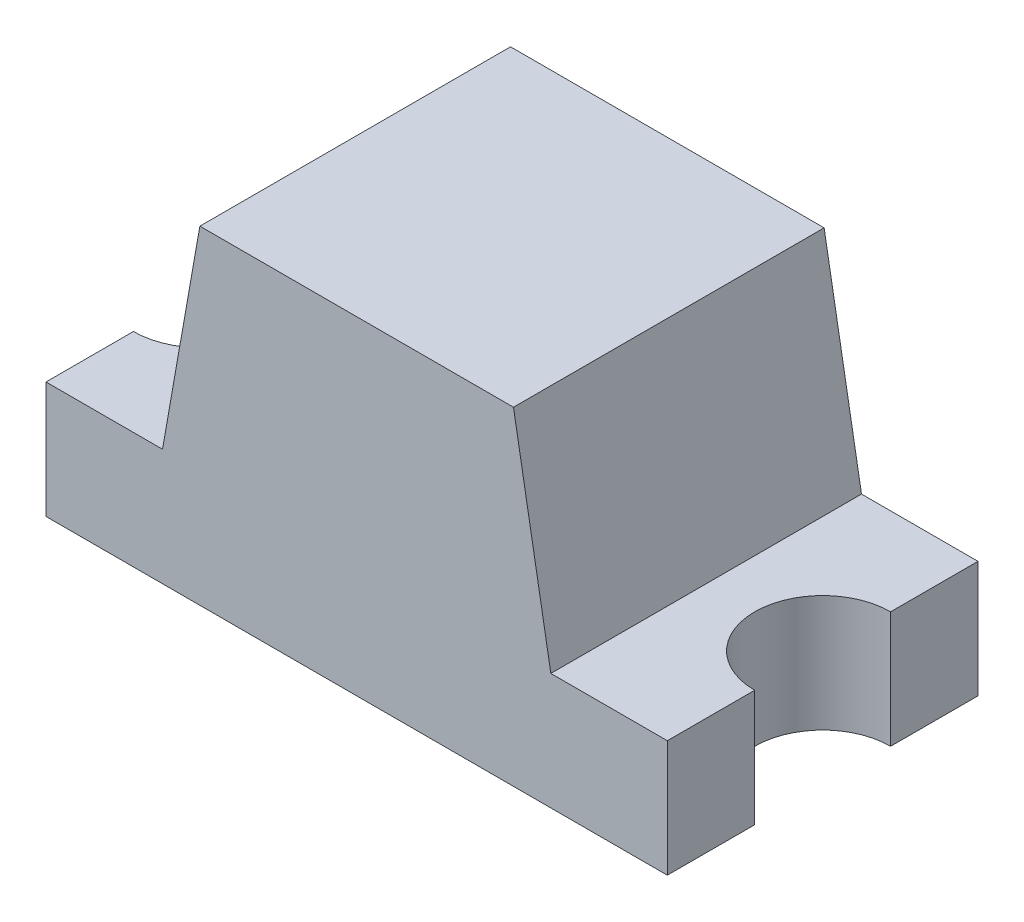
ISO-10303-21;
HEADER;
FILE_DESCRIPTION(('STEP AP214'),'2;1');
FILE_NAME('part.step','',(''),(''),'','','');
FILE_SCHEMA(('AUTOMOTIVE_DESIGN { 1 0 10303 214 1 1 1 1 }'));
ENDSEC;
DATA;
#1=APPLICATION_CONTEXT('core data for automotive mechanical design processes');
#2=APPLICATION_PROTOCOL_DEFINITION('international standard','automotive_design',2000,#1);
#3=PRODUCT_CONTEXT('',#1,'mechanical');
#4=PRODUCT('Part','Part','',(#3));
#5=PRODUCT_RELATED_PRODUCT_CATEGORY('part','',(#4));
#6=PRODUCT_DEFINITION_FORMATION('','',#4);
#7=PRODUCT_DEFINITION_CONTEXT('part definition',#1,'design');
#8=PRODUCT_DEFINITION('design','',#6,#7);
#9=PRODUCT_DEFINITION_SHAPE('','',#8);
#10=(LENGTH_UNIT() NAMED_UNIT(*) SI_UNIT(.MILLI.,.METRE.));
#11=(NAMED_UNIT(*) PLANE_ANGLE_UNIT() SI_UNIT($,.RADIAN.));
#12=(NAMED_UNIT(*) SI_UNIT($,.STERADIAN.) SOLID_ANGLE_UNIT());
#13=UNCERTAINTY_MEASURE_WITH_UNIT(LENGTH_MEASURE(1.E-05),#10,'distance_accuracy_value','');
#14=(GEOMETRIC_REPRESENTATION_CONTEXT(3) GLOBAL_UNCERTAINTY_ASSIGNED_CONTEXT((#13)) GLOBAL_UNIT_ASSIGNED_CONTEXT((#10,
#11,#12)) REPRESENTATION_CONTEXT('',''));
#15=CARTESIAN_POINT('',(0.,0.,0.));
#16=DIRECTION('',(0.,0.,1.));
#17=DIRECTION('',(1.,0.,0.));
#18=AXIS2_PLACEMENT_3D('',#15,#16,#17);
#19=CARTESIAN_POINT('',(0.40379548164148,0.845602935931751,0.4));
#20=DIRECTION('',(0.984807753012208,0.17364817766693,0.));
#21=DIRECTION('',(-0.17364817766693,0.984807753012208,0.));
#22=AXIS2_PLACEMENT_3D('',#19,#20,#21);
#23=PLANE('',#22);
#24=DIRECTION('',(0.173648177666931,-0.984807753012208,0.));
#25=VECTOR('',#24,1.);
#26=CARTESIAN_POINT('',(0.40379548164148,0.845602935931751,-0.4));
#27=LINE('',#26,#25);
#28=CARTESIAN_POINT('',(0.40379548164148,0.845602935931751,-0.4));
#29=VERTEX_POINT('',#28);
#30=CARTESIAN_POINT('',(0.5,0.3,-0.4));
#31=VERTEX_POINT('',#30);
#32=EDGE_CURVE('E145',#29,#31,#27,.T.);
#33=ORIENTED_EDGE('',*,*,#32,.F.);
#34=DIRECTION('',(0.,0.,1.));
#35=VECTOR('',#34,1.);
#36=CARTESIAN_POINT('',(0.40379548164148,0.845602935931751,0.4));
#37=LINE('',#36,#35);
#38=CARTESIAN_POINT('',(0.40379548164148,0.845602935931751,0.4));
#39=VERTEX_POINT('',#38);
#40=EDGE_CURVE('E130',#39,#29,#37,.F.);
#41=ORIENTED_EDGE('',*,*,#40,.F.);
#42=DIRECTION('',(-0.173648177666931,0.984807753012208,0.));
#43=VECTOR('',#42,1.);
#44=CARTESIAN_POINT('',(0.5,0.3,0.4));
#45=LINE('',#44,#43);
#46=CARTESIAN_POINT('',(0.5,0.3,0.4));
#47=VERTEX_POINT('',#46);
#48=EDGE_CURVE('E179',#47,#39,#45,.T.);
#49=ORIENTED_EDGE('',*,*,#48,.F.);
#50=DIRECTION('',(0.,0.,1.));
#51=VECTOR('',#50,1.);
#52=CARTESIAN_POINT('',(0.5,0.3,0.));
#53=LINE('',#52,#51);
#54=EDGE_CURVE('E152',#31,#47,#53,.T.);
#55=ORIENTED_EDGE('',*,*,#54,.F.);
#56=EDGE_LOOP('',(#33,#41,#49,#55));
#57=FACE_BOUND('',#56,.T.);
#58=ADVANCED_FACE('F20',(#57),#23,.T.);
#59=CARTESIAN_POINT('',(-0.403795481641481,0.845602935931751,0.4));
#60=DIRECTION('',(0.,1.,0.));
#61=DIRECTION('',(0.,0.,1.));
#62=AXIS2_PLACEMENT_3D('',#59,#60,#61);
#63=PLANE('',#62);
#64=DIRECTION('',(-1.,0.,0.));
#65=VECTOR('',#64,1.);
#66=CARTESIAN_POINT('',(0.8,0.845602935931751,-0.4));
#67=LINE('',#66,#65);
#68=CARTESIAN_POINT('',(-0.403795481641481,0.845602935931751,-0.4));
#69=VERTEX_POINT('',#68);
#70=EDGE_CURVE('E134',#69,#29,#67,.F.);
#71=ORIENTED_EDGE('',*,*,#70,.F.);
#72=DIRECTION('',(0.,0.,1.));
#73=VECTOR('',#72,1.);
#74=CARTESIAN_POINT('',(-0.403795481641481,0.845602935931751,0.4));
#75=LINE('',#74,#73);
#76=CARTESIAN_POINT('',(-0.403795481641481,0.845602935931751,0.4));
#77=VERTEX_POINT('',#76);
#78=EDGE_CURVE('E140',#77,#69,#75,.F.);
#79=ORIENTED_EDGE('',*,*,#78,.F.);
#80=DIRECTION('',(1.,0.,0.));
#81=VECTOR('',#80,1.);
#82=CARTESIAN_POINT('',(-0.800000000000001,0.845602935931751,0.4));
#83=LINE('',#82,#81);
#84=EDGE_CURVE('E135',#39,#77,#83,.F.);
#85=ORIENTED_EDGE('',*,*,#84,.F.);
#86=ORIENTED_EDGE('',*,*,#40,.T.);
#87=EDGE_LOOP('',(#71,#79,#85,#86));
#88=FACE_BOUND('',#87,.T.);
#89=ADVANCED_FACE('F132',(#88),#63,.T.);
#90=CARTESIAN_POINT('',(-0.5,0.3,0.4));
#91=DIRECTION('',(-0.984807753012208,0.17364817766693,0.));
#92=DIRECTION('',(-0.17364817766693,-0.984807753012208,0.));
#93=AXIS2_PLACEMENT_3D('',#90,#91,#92);
#94=PLANE('',#93);
#95=DIRECTION('',(0.173648177666929,0.984807753012208,0.));
#96=VECTOR('',#95,1.);
#97=CARTESIAN_POINT('',(-0.5,0.3,-0.4));
#98=LINE('',#97,#96);
#99=CARTESIAN_POINT('',(-0.5,0.3,-0.4));
#100=VERTEX_POINT('',#99);
#101=EDGE_CURVE('E149',#100,#69,#98,.T.);
#102=ORIENTED_EDGE('',*,*,#101,.F.);
#103=DIRECTION('',(0.,0.,1.));
#104=VECTOR('',#103,1.);
#105=CARTESIAN_POINT('',(-0.5,0.3,0.));
#106=LINE('',#105,#104);
#107=CARTESIAN_POINT('',(-0.5,0.3,0.4));
#108=VERTEX_POINT('',#107);
#109=EDGE_CURVE('E184',#108,#100,#106,.F.);
#110=ORIENTED_EDGE('',*,*,#109,.F.);
#111=DIRECTION('',(-0.173648177666929,-0.984807753012208,0.));
#112=VECTOR('',#111,1.);
#113=CARTESIAN_POINT('',(-0.403795481641481,0.845602935931751,0.4));
#114=LINE('',#113,#112);
#115=EDGE_CURVE('E239',#77,#108,#114,.T.);
#116=ORIENTED_EDGE('',*,*,#115,.F.);
#117=ORIENTED_EDGE('',*,*,#78,.T.);
#118=EDGE_LOOP('',(#102,#110,#116,#117));
#119=FACE_BOUND('',#118,.T.);
#120=ADVANCED_FACE('F393',(#119),#94,.T.);
#121=CARTESIAN_POINT('',(0.,0.3,0.));
#122=DIRECTION('',(0.,1.,0.));
#123=DIRECTION('',(0.,0.,1.));
#124=AXIS2_PLACEMENT_3D('',#121,#122,#123);
#125=PLANE('',#124);
#126=CARTESIAN_POINT('',(-0.8,0.3,0.));
#127=DIRECTION('',(0.,1.,0.));
#128=DIRECTION('',(0.,0.,1.));
#129=AXIS2_PLACEMENT_3D('',#126,#127,#128);
#130=CIRCLE('',#129,0.175);
#131=CARTESIAN_POINT('',(-0.8,0.3,-0.175));
#132=VERTEX_POINT('',#131);
#133=CARTESIAN_POINT('',(-0.800000000000001,0.3,0.175));
#134=VERTEX_POINT('',#133);
#135=EDGE_CURVE('E24',#132,#134,#130,.F.);
#136=ORIENTED_EDGE('',*,*,#135,.T.);
#137=DIRECTION('',(0.,0.,1.));
#138=VECTOR('',#137,1.);
#139=CARTESIAN_POINT('',(-0.800000000000001,0.3,0.175));
#140=LINE('',#139,#138);
#141=CARTESIAN_POINT('',(-0.800000000000001,0.3,0.4));
#142=VERTEX_POINT('',#141);
#143=EDGE_CURVE('E230',#142,#134,#140,.F.);
#144=ORIENTED_EDGE('',*,*,#143,.F.);
#145=DIRECTION('',(1.,0.,0.));
#146=VECTOR('',#145,1.);
#147=CARTESIAN_POINT('',(-0.800000000000001,0.3,0.4));
#148=LINE('',#147,#146);
#149=EDGE_CURVE('E235',#108,#142,#148,.F.);
#150=ORIENTED_EDGE('',*,*,#149,.F.);
#151=ORIENTED_EDGE('',*,*,#109,.T.);
#152=DIRECTION('',(-1.,0.,0.));
#153=VECTOR('',#152,1.);
#154=CARTESIAN_POINT('',(0.8,0.3,-0.4));
#155=LINE('',#154,#153);
#156=CARTESIAN_POINT('',(-0.8,0.3,-0.4));
#157=VERTEX_POINT('',#156);
#158=EDGE_CURVE('E193',#157,#100,#155,.F.);
#159=ORIENTED_EDGE('',*,*,#158,.F.);
#160=DIRECTION('',(0.,0.,1.));
#161=VECTOR('',#160,1.);
#162=CARTESIAN_POINT('',(-0.8,0.3,-0.4));
#163=LINE('',#162,#161);
#164=EDGE_CURVE('E81',#132,#157,#163,.F.);
#165=ORIENTED_EDGE('',*,*,#164,.F.);
#166=EDGE_LOOP('',(#136,#144,#150,#151,#159,#165));
#167=FACE_BOUND('',#166,.T.);
#168=ADVANCED_FACE('F350',(#167),#125,.T.);
#169=CARTESIAN_POINT('',(0.,0.3,0.));
#170=DIRECTION('',(0.,1.,0.));
#171=DIRECTION('',(0.,0.,1.));
#172=AXIS2_PLACEMENT_3D('',#169,#170,#171);
#173=PLANE('',#172);
#174=DIRECTION('',(0.,0.,-1.));
#175=VECTOR('',#174,1.);
#176=CARTESIAN_POINT('',(0.8,0.3,-0.175));
#177=LINE('',#176,#175);
#178=CARTESIAN_POINT('',(0.8,0.3,-0.4));
#179=VERTEX_POINT('',#178);
#180=CARTESIAN_POINT('',(0.8,0.3,-0.175));
#181=VERTEX_POINT('',#180);
#182=EDGE_CURVE('E183',#179,#181,#177,.F.);
#183=ORIENTED_EDGE('',*,*,#182,.F.);
#184=DIRECTION('',(-1.,0.,0.));
#185=VECTOR('',#184,1.);
#186=CARTESIAN_POINT('',(0.8,0.3,-0.4));
#187=LINE('',#186,#185);
#188=EDGE_CURVE('E155',#31,#179,#187,.F.);
#189=ORIENTED_EDGE('',*,*,#188,.F.);
#190=ORIENTED_EDGE('',*,*,#54,.T.);
#191=DIRECTION('',(1.,0.,0.));
#192=VECTOR('',#191,1.);
#193=CARTESIAN_POINT('',(-0.800000000000001,0.3,0.4));
#194=LINE('',#193,#192);
#195=CARTESIAN_POINT('',(0.8,0.3,0.4));
#196=VERTEX_POINT('',#195);
#197=EDGE_CURVE('E223',#196,#47,#194,.F.);
#198=ORIENTED_EDGE('',*,*,#197,.F.);
#199=DIRECTION('',(0.,0.,-1.));
#200=VECTOR('',#199,1.);
#201=CARTESIAN_POINT('',(0.8,0.3,0.4));
#202=LINE('',#201,#200);
#203=CARTESIAN_POINT('',(0.8,0.3,0.175));
#204=VERTEX_POINT('',#203);
#205=EDGE_CURVE('E216',#204,#196,#202,.F.);
#206=ORIENTED_EDGE('',*,*,#205,.F.);
#207=CARTESIAN_POINT('',(0.8,0.3,0.));
#208=DIRECTION('',(0.,1.,0.));
#209=DIRECTION('',(0.,0.,1.));
#210=AXIS2_PLACEMENT_3D('',#207,#208,#209);
#211=CIRCLE('',#210,0.175);
#212=EDGE_CURVE('E261',#204,#181,#211,.F.);
#213=ORIENTED_EDGE('',*,*,#212,.T.);
#214=EDGE_LOOP('',(#183,#189,#190,#198,#206,#213));
#215=FACE_BOUND('',#214,.T.);
#216=ADVANCED_FACE('F358',(#215),#173,.T.);
#217=CARTESIAN_POINT('',(0.8,0.,-0.175));
#218=DIRECTION('',(1.,0.,0.));
#219=DIRECTION('',(0.,0.,-1.));
#220=AXIS2_PLACEMENT_3D('',#217,#218,#219);
#221=PLANE('',#220);
#222=ORIENTED_EDGE('',*,*,#182,.T.);
#223=DIRECTION('',(0.,1.,0.));
#224=VECTOR('',#223,1.);
#225=CARTESIAN_POINT('',(0.8,0.,-0.175));
#226=LINE('',#225,#224);
#227=CARTESIAN_POINT('',(0.8,0.,-0.175));
#228=VERTEX_POINT('',#227);
#229=EDGE_CURVE('E264',#181,#228,#226,.F.);
#230=ORIENTED_EDGE('',*,*,#229,.T.);
#231=DIRECTION('',(0.,0.,1.));
#232=VECTOR('',#231,1.);
#233=CARTESIAN_POINT('',(0.8,0.,0.));
#234=LINE('',#233,#232);
#235=CARTESIAN_POINT('',(0.8,0.,-0.4));
#236=VERTEX_POINT('',#235);
#237=EDGE_CURVE('E267',#228,#236,#234,.F.);
#238=ORIENTED_EDGE('',*,*,#237,.T.);
#239=DIRECTION('',(0.,1.,0.));
#240=VECTOR('',#239,1.);
#241=CARTESIAN_POINT('',(0.8,0.,-0.4));
#242=LINE('',#241,#240);
#243=EDGE_CURVE('E159',#179,#236,#242,.F.);
#244=ORIENTED_EDGE('',*,*,#243,.F.);
#245=EDGE_LOOP('',(#222,#230,#238,#244));
#246=FACE_BOUND('',#245,.T.);
#247=ADVANCED_FACE('F416',(#246),#221,.T.);
#248=CARTESIAN_POINT('',(0.8,0.,-0.4));
#249=DIRECTION('',(0.,0.,-1.));
#250=DIRECTION('',(-1.,0.,0.));
#251=AXIS2_PLACEMENT_3D('',#248,#249,#250);
#252=PLANE('',#251);
#253=ORIENTED_EDGE('',*,*,#188,.T.);
#254=ORIENTED_EDGE('',*,*,#243,.T.);
#255=DIRECTION('',(1.,0.,0.));
#256=VECTOR('',#255,1.);
#257=CARTESIAN_POINT('',(0.,0.,-0.4));
#258=LINE('',#257,#256);
#259=CARTESIAN_POINT('',(-0.8,0.,-0.4));
#260=VERTEX_POINT('',#259);
#261=EDGE_CURVE('E289',#236,#260,#258,.F.);
#262=ORIENTED_EDGE('',*,*,#261,.T.);
#263=DIRECTION('',(0.,1.,0.));
#264=VECTOR('',#263,1.);
#265=CARTESIAN_POINT('',(-0.8,0.,-0.4));
#266=LINE('',#265,#264);
#267=EDGE_CURVE('E190',#157,#260,#266,.F.);
#268=ORIENTED_EDGE('',*,*,#267,.F.);
#269=ORIENTED_EDGE('',*,*,#158,.T.);
#270=ORIENTED_EDGE('',*,*,#101,.T.);
#271=ORIENTED_EDGE('',*,*,#70,.T.);
#272=ORIENTED_EDGE('',*,*,#32,.T.);
#273=EDGE_LOOP('',(#253,#254,#262,#268,#269,#270,#271,#272));
#274=FACE_BOUND('',#273,.T.);
#275=ADVANCED_FACE('F144',(#274),#252,.T.);
#276=CARTESIAN_POINT('',(-0.8,0.,-0.4));
#277=DIRECTION('',(-1.,0.,0.));
#278=DIRECTION('',(0.,0.,1.));
#279=AXIS2_PLACEMENT_3D('',#276,#277,#278);
#280=PLANE('',#279);
#281=ORIENTED_EDGE('',*,*,#164,.T.);
#282=ORIENTED_EDGE('',*,*,#267,.T.);
#283=DIRECTION('',(0.,0.,1.));
#284=VECTOR('',#283,1.);
#285=CARTESIAN_POINT('',(-0.8,0.,0.));
#286=LINE('',#285,#284);
#287=CARTESIAN_POINT('',(-0.8,0.,-0.175));
#288=VERTEX_POINT('',#287);
#289=EDGE_CURVE('E260',#260,#288,#286,.T.);
#290=ORIENTED_EDGE('',*,*,#289,.T.);
#291=DIRECTION('',(0.,1.,0.));
#292=VECTOR('',#291,1.);
#293=CARTESIAN_POINT('',(-0.8,0.,-0.175));
#294=LINE('',#293,#292);
#295=EDGE_CURVE('E316',#288,#132,#294,.T.);
#296=ORIENTED_EDGE('',*,*,#295,.T.);
#297=EDGE_LOOP('',(#281,#282,#290,#296));
#298=FACE_BOUND('',#297,.T.);
#299=ADVANCED_FACE('F315',(#298),#280,.T.);
#300=CARTESIAN_POINT('',(-0.8,0.,0.));
#301=DIRECTION('',(0.,1.,0.));
#302=DIRECTION('',(0.,0.,1.));
#303=AXIS2_PLACEMENT_3D('',#300,#301,#302);
#304=CYLINDRICAL_SURFACE('',#303,0.175);
#305=DIRECTION('',(0.,1.,0.));
#306=VECTOR('',#305,1.);
#307=CARTESIAN_POINT('',(-0.800000000000001,0.,0.175));
#308=LINE('',#307,#306);
#309=CARTESIAN_POINT('',(-0.800000000000001,0.,0.175));
#310=VERTEX_POINT('',#309);
#311=EDGE_CURVE('E227',#134,#310,#308,.F.);
#312=ORIENTED_EDGE('',*,*,#311,.F.);
#313=ORIENTED_EDGE('',*,*,#135,.F.);
#314=ORIENTED_EDGE('',*,*,#295,.F.);
#315=CARTESIAN_POINT('',(-0.8,0.,0.));
#316=DIRECTION('',(0.,1.,0.));
#317=DIRECTION('',(0.,0.,1.));
#318=AXIS2_PLACEMENT_3D('',#315,#316,#317);
#319=CIRCLE('',#318,0.175);
#320=EDGE_CURVE('E256',#288,#310,#319,.F.);
#321=ORIENTED_EDGE('',*,*,#320,.T.);
#322=EDGE_LOOP('',(#312,#313,#314,#321));
#323=FACE_BOUND('',#322,.T.);
#324=ADVANCED_FACE('F345',(#323),#304,.F.);
#325=CARTESIAN_POINT('',(-0.800000000000001,0.,0.175));
#326=DIRECTION('',(-1.,0.,0.));
#327=DIRECTION('',(0.,0.,1.));
#328=AXIS2_PLACEMENT_3D('',#325,#326,#327);
#329=PLANE('',#328);
#330=ORIENTED_EDGE('',*,*,#143,.T.);
#331=ORIENTED_EDGE('',*,*,#311,.T.);
#332=DIRECTION('',(0.,0.,1.));
#333=VECTOR('',#332,1.);
#334=CARTESIAN_POINT('',(-0.800000000000001,0.,0.));
#335=LINE('',#334,#333);
#336=CARTESIAN_POINT('',(-0.800000000000001,0.,0.4));
#337=VERTEX_POINT('',#336);
#338=EDGE_CURVE('E259',#310,#337,#335,.T.);
#339=ORIENTED_EDGE('',*,*,#338,.T.);
#340=DIRECTION('',(0.,1.,0.));
#341=VECTOR('',#340,1.);
#342=CARTESIAN_POINT('',(-0.800000000000001,0.,0.4));
#343=LINE('',#342,#341);
#344=EDGE_CURVE('E220',#142,#337,#343,.F.);
#345=ORIENTED_EDGE('',*,*,#344,.F.);
#346=EDGE_LOOP('',(#330,#331,#339,#345));
#347=FACE_BOUND('',#346,.T.);
#348=ADVANCED_FACE('F340',(#347),#329,.T.);
#349=CARTESIAN_POINT('',(-0.800000000000001,0.,0.4));
#350=DIRECTION('',(0.,0.,1.));
#351=DIRECTION('',(1.,0.,0.));
#352=AXIS2_PLACEMENT_3D('',#349,#350,#351);
#353=PLANE('',#352);
#354=ORIENTED_EDGE('',*,*,#149,.T.);
#355=ORIENTED_EDGE('',*,*,#344,.T.);
#356=DIRECTION('',(1.,0.,0.));
#357=VECTOR('',#356,1.);
#358=CARTESIAN_POINT('',(0.,0.,0.4));
#359=LINE('',#358,#357);
#360=CARTESIAN_POINT('',(0.8,0.,0.4));
#361=VERTEX_POINT('',#360);
#362=EDGE_CURVE('E327',#337,#361,#359,.T.);
#363=ORIENTED_EDGE('',*,*,#362,.T.);
#364=DIRECTION('',(0.,1.,0.));
#365=VECTOR('',#364,1.);
#366=CARTESIAN_POINT('',(0.8,0.,0.4));
#367=LINE('',#366,#365);
#368=EDGE_CURVE('E219',#196,#361,#367,.F.);
#369=ORIENTED_EDGE('',*,*,#368,.F.);
#370=ORIENTED_EDGE('',*,*,#197,.T.);
#371=ORIENTED_EDGE('',*,*,#48,.T.);
#372=ORIENTED_EDGE('',*,*,#84,.T.);
#373=ORIENTED_EDGE('',*,*,#115,.T.);
#374=EDGE_LOOP('',(#354,#355,#363,#369,#370,#371,#372,#373));
#375=FACE_BOUND('',#374,.T.);
#376=ADVANCED_FACE('F360',(#375),#353,.T.);
#377=CARTESIAN_POINT('',(0.8,0.,0.4));
#378=DIRECTION('',(1.,0.,0.));
#379=DIRECTION('',(0.,0.,-1.));
#380=AXIS2_PLACEMENT_3D('',#377,#378,#379);
#381=PLANE('',#380);
#382=ORIENTED_EDGE('',*,*,#205,.T.);
#383=ORIENTED_EDGE('',*,*,#368,.T.);
#384=DIRECTION('',(0.,0.,1.));
#385=VECTOR('',#384,1.);
#386=CARTESIAN_POINT('',(0.8,0.,0.));
#387=LINE('',#386,#385);
#388=CARTESIAN_POINT('',(0.8,0.,0.175));
#389=VERTEX_POINT('',#388);
#390=EDGE_CURVE('E31',#361,#389,#387,.F.);
#391=ORIENTED_EDGE('',*,*,#390,.T.);
#392=DIRECTION('',(0.,1.,0.));
#393=VECTOR('',#392,1.);
#394=CARTESIAN_POINT('',(0.8,0.,0.175));
#395=LINE('',#394,#393);
#396=EDGE_CURVE('E42',#389,#204,#395,.T.);
#397=ORIENTED_EDGE('',*,*,#396,.T.);
#398=EDGE_LOOP('',(#382,#383,#391,#397));
#399=FACE_BOUND('',#398,.T.);
#400=ADVANCED_FACE('F357',(#399),#381,.T.);
#401=CARTESIAN_POINT('',(0.8,0.,0.));
#402=DIRECTION('',(0.,1.,0.));
#403=DIRECTION('',(0.,0.,1.));
#404=AXIS2_PLACEMENT_3D('',#401,#402,#403);
#405=CYLINDRICAL_SURFACE('',#404,0.175);
#406=ORIENTED_EDGE('',*,*,#229,.F.);
#407=ORIENTED_EDGE('',*,*,#212,.F.);
#408=ORIENTED_EDGE('',*,*,#396,.F.);
#409=CARTESIAN_POINT('',(0.8,0.,0.));
#410=DIRECTION('',(0.,1.,0.));
#411=DIRECTION('',(0.,0.,1.));
#412=AXIS2_PLACEMENT_3D('',#409,#410,#411);
#413=CIRCLE('',#412,0.175);
#414=EDGE_CURVE('E12',#389,#228,#413,.F.);
#415=ORIENTED_EDGE('',*,*,#414,.T.);
#416=EDGE_LOOP('',(#406,#407,#408,#415));
#417=FACE_BOUND('',#416,.T.);
#418=ADVANCED_FACE('F368',(#417),#405,.F.);
#419=CARTESIAN_POINT('',(0.,0.,0.));
#420=DIRECTION('',(0.,1.,0.));
#421=DIRECTION('',(0.,0.,1.));
#422=AXIS2_PLACEMENT_3D('',#419,#420,#421);
#423=PLANE('',#422);
#424=ORIENTED_EDGE('',*,*,#390,.F.);
#425=ORIENTED_EDGE('',*,*,#362,.F.);
#426=ORIENTED_EDGE('',*,*,#338,.F.);
#427=ORIENTED_EDGE('',*,*,#320,.F.);
#428=ORIENTED_EDGE('',*,*,#289,.F.);
#429=ORIENTED_EDGE('',*,*,#261,.F.);
#430=ORIENTED_EDGE('',*,*,#237,.F.);
#431=ORIENTED_EDGE('',*,*,#414,.F.);
#432=EDGE_LOOP('',(#424,#425,#426,#427,#428,#429,#430,#431));
#433=FACE_BOUND('',#432,.T.);
#434=ADVANCED_FACE('F312',(#433),#423,.F.);
#435=CLOSED_SHELL('',(#58,#89,#120,#168,#216,#247,#275,#299,#324,#348,#376,#400,#418,#434));
#436=MANIFOLD_SOLID_BREP('B1',#435);
#437=ADVANCED_BREP_SHAPE_REPRESENTATION('',(#18,#436),#14);
#438=SHAPE_DEFINITION_REPRESENTATION(#9,#437);
ENDSEC;
END-ISO-10303-21;
